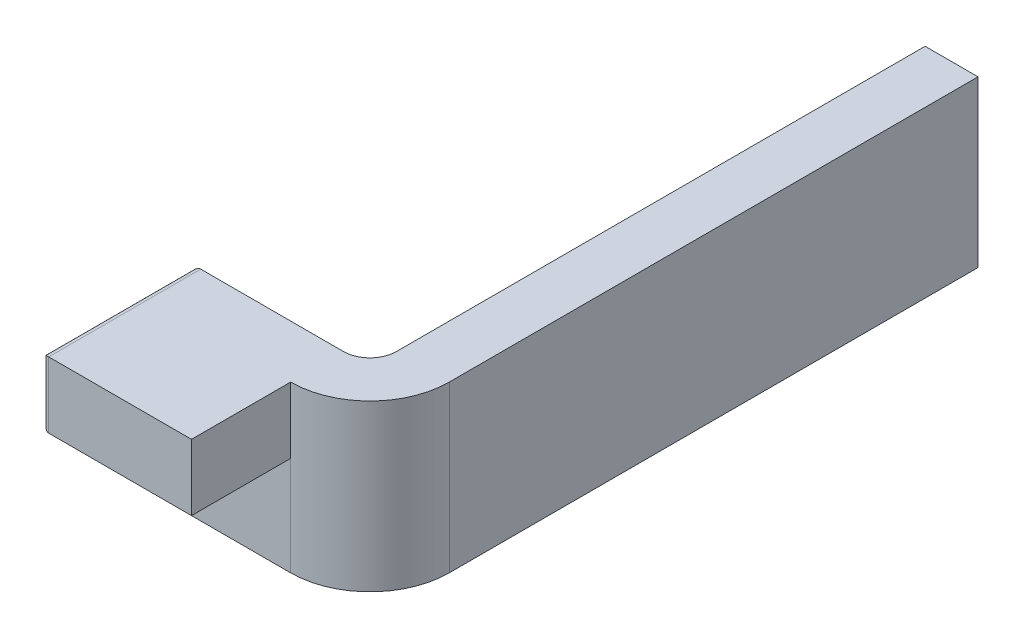
ISO-10303-21;
HEADER;
FILE_DESCRIPTION(('STEP AP214'),'2;1');
FILE_NAME('part.step','',(''),(''),'','','');
FILE_SCHEMA(('AUTOMOTIVE_DESIGN { 1 0 10303 214 1 1 1 1 }'));
ENDSEC;
DATA;
#1=APPLICATION_CONTEXT('core data for automotive mechanical design processes');
#2=APPLICATION_PROTOCOL_DEFINITION('international standard','automotive_design',2000,#1);
#3=PRODUCT_CONTEXT('',#1,'mechanical');
#4=PRODUCT('Part','Part','',(#3));
#5=PRODUCT_RELATED_PRODUCT_CATEGORY('part','',(#4));
#6=PRODUCT_DEFINITION_FORMATION('','',#4);
#7=PRODUCT_DEFINITION_CONTEXT('part definition',#1,'design');
#8=PRODUCT_DEFINITION('design','',#6,#7);
#9=PRODUCT_DEFINITION_SHAPE('','',#8);
#10=(LENGTH_UNIT() NAMED_UNIT(*) SI_UNIT(.MILLI.,.METRE.));
#11=(NAMED_UNIT(*) PLANE_ANGLE_UNIT() SI_UNIT($,.RADIAN.));
#12=(NAMED_UNIT(*) SI_UNIT($,.STERADIAN.) SOLID_ANGLE_UNIT());
#13=UNCERTAINTY_MEASURE_WITH_UNIT(LENGTH_MEASURE(1.E-05),#10,'distance_accuracy_value','');
#14=(GEOMETRIC_REPRESENTATION_CONTEXT(3) GLOBAL_UNCERTAINTY_ASSIGNED_CONTEXT((#13)) GLOBAL_UNIT_ASSIGNED_CONTEXT((#10,
#11,#12)) REPRESENTATION_CONTEXT('',''));
#15=CARTESIAN_POINT('',(0.,0.,0.));
#16=DIRECTION('',(0.,0.,1.));
#17=DIRECTION('',(1.,0.,0.));
#18=AXIS2_PLACEMENT_3D('',#15,#16,#17);
#19=CARTESIAN_POINT('',(0.,25.,8.));
#20=DIRECTION('',(0.,0.,-1.));
#21=DIRECTION('',(-1.,0.,0.));
#22=AXIS2_PLACEMENT_3D('',#19,#20,#21);
#23=PLANE('',#22);
#24=DIRECTION('',(1.,0.,0.));
#25=VECTOR('',#24,1.);
#26=CARTESIAN_POINT('',(0.,15.,8.));
#27=LINE('',#26,#25);
#28=CARTESIAN_POINT('',(1.,15.,8.));
#29=VERTEX_POINT('',#28);
#30=CARTESIAN_POINT('',(22.6,15.,8.));
#31=VERTEX_POINT('',#30);
#32=EDGE_CURVE('E152',#29,#31,#27,.T.);
#33=ORIENTED_EDGE('',*,*,#32,.F.);
#34=DIRECTION('',(0.,-1.,0.));
#35=VECTOR('',#34,1.);
#36=CARTESIAN_POINT('',(1.,25.,8.));
#37=LINE('',#36,#35);
#38=CARTESIAN_POINT('',(1.,0.,8.));
#39=VERTEX_POINT('',#38);
#40=EDGE_CURVE('E66',#29,#39,#37,.T.);
#41=ORIENTED_EDGE('',*,*,#40,.T.);
#42=DIRECTION('',(1.,0.,0.));
#43=VECTOR('',#42,1.);
#44=CARTESIAN_POINT('',(0.,0.,8.));
#45=LINE('',#44,#43);
#46=CARTESIAN_POINT('',(22.6,0.,8.));
#47=VERTEX_POINT('',#46);
#48=EDGE_CURVE('E194',#39,#47,#45,.T.);
#49=ORIENTED_EDGE('',*,*,#48,.T.);
#50=DIRECTION('',(0.,-1.,0.));
#51=VECTOR('',#50,1.);
#52=CARTESIAN_POINT('',(22.6,25.,8.));
#53=LINE('',#52,#51);
#54=EDGE_CURVE('E214',#31,#47,#53,.T.);
#55=ORIENTED_EDGE('',*,*,#54,.F.);
#56=EDGE_LOOP('',(#33,#41,#49,#55));
#57=FACE_BOUND('',#56,.T.);
#58=ADVANCED_FACE('F41',(#57),#23,.F.);
#59=CARTESIAN_POINT('',(22.6,25.,-4.));
#60=DIRECTION('',(0.,-1.,0.));
#61=DIRECTION('',(0.,0.,-1.));
#62=AXIS2_PLACEMENT_3D('',#59,#60,#61);
#63=CYLINDRICAL_SURFACE('',#62,4.);
#64=CARTESIAN_POINT('',(22.6,0.,-4.));
#65=DIRECTION('',(0.,-1.,0.));
#66=DIRECTION('',(0.,0.,1.));
#67=AXIS2_PLACEMENT_3D('',#64,#65,#66);
#68=CIRCLE('',#67,4.);
#69=CARTESIAN_POINT('',(26.6,0.,-4.));
#70=VERTEX_POINT('',#69);
#71=CARTESIAN_POINT('',(22.6,0.,0.));
#72=VERTEX_POINT('',#71);
#73=EDGE_CURVE('E160',#70,#72,#68,.T.);
#74=ORIENTED_EDGE('',*,*,#73,.T.);
#75=DIRECTION('',(0.,-1.,0.));
#76=VECTOR('',#75,1.);
#77=CARTESIAN_POINT('',(22.6,25.,0.));
#78=LINE('',#77,#76);
#79=CARTESIAN_POINT('',(22.6,25.,0.));
#80=VERTEX_POINT('',#79);
#81=EDGE_CURVE('E218',#80,#72,#78,.T.);
#82=ORIENTED_EDGE('',*,*,#81,.F.);
#83=CARTESIAN_POINT('',(22.6,25.,-4.));
#84=DIRECTION('',(0.,-1.,0.));
#85=DIRECTION('',(0.,0.,1.));
#86=AXIS2_PLACEMENT_3D('',#83,#84,#85);
#87=CIRCLE('',#86,4.);
#88=CARTESIAN_POINT('',(26.6,25.,-4.));
#89=VERTEX_POINT('',#88);
#90=EDGE_CURVE('E171',#89,#80,#87,.T.);
#91=ORIENTED_EDGE('',*,*,#90,.F.);
#92=DIRECTION('',(0.,-1.,0.));
#93=VECTOR('',#92,1.);
#94=CARTESIAN_POINT('',(26.6,25.,-4.));
#95=LINE('',#94,#93);
#96=EDGE_CURVE('E186',#89,#70,#95,.T.);
#97=ORIENTED_EDGE('',*,*,#96,.T.);
#98=EDGE_LOOP('',(#74,#82,#91,#97));
#99=FACE_BOUND('',#98,.T.);
#100=ADVANCED_FACE('F289',(#99),#63,.F.);
#101=CARTESIAN_POINT('',(0.,25.,0.));
#102=DIRECTION('',(0.,0.,1.));
#103=DIRECTION('',(1.,0.,0.));
#104=AXIS2_PLACEMENT_3D('',#101,#102,#103);
#105=PLANE('',#104);
#106=DIRECTION('',(-1.,0.,0.));
#107=VECTOR('',#106,1.);
#108=CARTESIAN_POINT('',(0.,0.,0.));
#109=LINE('',#108,#107);
#110=CARTESIAN_POINT('',(1.,0.,0.));
#111=VERTEX_POINT('',#110);
#112=EDGE_CURVE('E189',#72,#111,#109,.T.);
#113=ORIENTED_EDGE('',*,*,#112,.T.);
#114=DIRECTION('',(0.,-1.,0.));
#115=VECTOR('',#114,1.);
#116=CARTESIAN_POINT('',(1.,25.,0.));
#117=LINE('',#116,#115);
#118=CARTESIAN_POINT('',(1.,25.,0.));
#119=VERTEX_POINT('',#118);
#120=EDGE_CURVE('E11',#111,#119,#117,.F.);
#121=ORIENTED_EDGE('',*,*,#120,.T.);
#122=DIRECTION('',(-1.,0.,0.));
#123=VECTOR('',#122,1.);
#124=CARTESIAN_POINT('',(0.,25.,0.));
#125=LINE('',#124,#123);
#126=EDGE_CURVE('E174',#80,#119,#125,.T.);
#127=ORIENTED_EDGE('',*,*,#126,.F.);
#128=ORIENTED_EDGE('',*,*,#81,.T.);
#129=EDGE_LOOP('',(#113,#121,#127,#128));
#130=FACE_BOUND('',#129,.T.);
#131=ADVANCED_FACE('F284',(#130),#105,.F.);
#132=CARTESIAN_POINT('',(0.,25.,0.));
#133=DIRECTION('',(1.,0.,0.));
#134=DIRECTION('',(0.,0.,-1.));
#135=AXIS2_PLACEMENT_3D('',#132,#133,#134);
#136=PLANE('',#135);
#137=DIRECTION('',(0.,0.,1.));
#138=VECTOR('',#137,1.);
#139=CARTESIAN_POINT('',(0.,0.,0.));
#140=LINE('',#139,#138);
#141=CARTESIAN_POINT('',(0.,0.,1.));
#142=VERTEX_POINT('',#141);
#143=CARTESIAN_POINT('',(0.,0.,7.));
#144=VERTEX_POINT('',#143);
#145=EDGE_CURVE('E191',#142,#144,#140,.T.);
#146=ORIENTED_EDGE('',*,*,#145,.T.);
#147=DIRECTION('',(0.,-1.,0.));
#148=VECTOR('',#147,1.);
#149=CARTESIAN_POINT('',(0.,25.,7.));
#150=LINE('',#149,#148);
#151=CARTESIAN_POINT('',(0.,16.,7.));
#152=VERTEX_POINT('',#151);
#153=EDGE_CURVE('E230',#144,#152,#150,.F.);
#154=ORIENTED_EDGE('',*,*,#153,.T.);
#155=DIRECTION('',(0.,0.,-1.));
#156=VECTOR('',#155,1.);
#157=CARTESIAN_POINT('',(0.,16.,0.));
#158=LINE('',#157,#156);
#159=CARTESIAN_POINT('',(0.,16.,22.));
#160=VERTEX_POINT('',#159);
#161=EDGE_CURVE('E228',#152,#160,#158,.F.);
#162=ORIENTED_EDGE('',*,*,#161,.T.);
#163=DIRECTION('',(0.,-1.,0.));
#164=VECTOR('',#163,1.);
#165=CARTESIAN_POINT('',(0.,25.,22.));
#166=LINE('',#165,#164);
#167=CARTESIAN_POINT('',(0.,24.,22.));
#168=VERTEX_POINT('',#167);
#169=EDGE_CURVE('E226',#160,#168,#166,.F.);
#170=ORIENTED_EDGE('',*,*,#169,.T.);
#171=DIRECTION('',(0.,0.,1.));
#172=VECTOR('',#171,1.);
#173=CARTESIAN_POINT('',(0.,24.,0.));
#174=LINE('',#173,#172);
#175=CARTESIAN_POINT('',(0.,24.,1.));
#176=VERTEX_POINT('',#175);
#177=EDGE_CURVE('E224',#168,#176,#174,.F.);
#178=ORIENTED_EDGE('',*,*,#177,.T.);
#179=DIRECTION('',(0.,-1.,0.));
#180=VECTOR('',#179,1.);
#181=CARTESIAN_POINT('',(0.,25.,1.));
#182=LINE('',#181,#180);
#183=EDGE_CURVE('E222',#176,#142,#182,.T.);
#184=ORIENTED_EDGE('',*,*,#183,.T.);
#185=EDGE_LOOP('',(#146,#154,#162,#170,#178,#184));
#186=FACE_BOUND('',#185,.T.);
#187=ADVANCED_FACE('F260',(#186),#136,.F.);
#188=CARTESIAN_POINT('',(22.6,25.,-4.));
#189=DIRECTION('',(0.,-1.,0.));
#190=DIRECTION('',(0.,0.,-1.));
#191=AXIS2_PLACEMENT_3D('',#188,#189,#190);
#192=CYLINDRICAL_SURFACE('',#191,12.);
#193=CARTESIAN_POINT('',(22.6,0.,-4.));
#194=DIRECTION('',(0.,1.,0.));
#195=DIRECTION('',(0.,0.,1.));
#196=AXIS2_PLACEMENT_3D('',#193,#194,#195);
#197=CIRCLE('',#196,12.);
#198=CARTESIAN_POINT('',(34.6,0.,-4.));
#199=VERTEX_POINT('',#198);
#200=EDGE_CURVE('E196',#47,#199,#197,.T.);
#201=ORIENTED_EDGE('',*,*,#200,.T.);
#202=DIRECTION('',(0.,-1.,0.));
#203=VECTOR('',#202,1.);
#204=CARTESIAN_POINT('',(34.6,25.,-4.));
#205=LINE('',#204,#203);
#206=CARTESIAN_POINT('',(34.6,25.,-4.));
#207=VERTEX_POINT('',#206);
#208=EDGE_CURVE('E211',#207,#199,#205,.T.);
#209=ORIENTED_EDGE('',*,*,#208,.F.);
#210=CARTESIAN_POINT('',(22.6,25.,-4.));
#211=DIRECTION('',(0.,1.,0.));
#212=DIRECTION('',(0.,0.,1.));
#213=AXIS2_PLACEMENT_3D('',#210,#211,#212);
#214=CIRCLE('',#213,12.);
#215=CARTESIAN_POINT('',(22.6,25.,8.));
#216=VERTEX_POINT('',#215);
#217=EDGE_CURVE('E178',#216,#207,#214,.T.);
#218=ORIENTED_EDGE('',*,*,#217,.F.);
#219=EDGE_CURVE('E215',#216,#31,#53,.T.);
#220=ORIENTED_EDGE('',*,*,#219,.T.);
#221=ORIENTED_EDGE('',*,*,#54,.T.);
#222=EDGE_LOOP('',(#201,#209,#218,#220,#221));
#223=FACE_BOUND('',#222,.T.);
#224=ADVANCED_FACE('F275',(#223),#192,.T.);
#225=CARTESIAN_POINT('',(34.6,25.,-4.));
#226=DIRECTION('',(-1.,0.,0.));
#227=DIRECTION('',(0.,0.,1.));
#228=AXIS2_PLACEMENT_3D('',#225,#226,#227);
#229=PLANE('',#228);
#230=DIRECTION('',(0.,0.,-1.));
#231=VECTOR('',#230,1.);
#232=CARTESIAN_POINT('',(34.6,0.,-4.));
#233=LINE('',#232,#231);
#234=CARTESIAN_POINT('',(34.6,0.,-84.));
#235=VERTEX_POINT('',#234);
#236=EDGE_CURVE('E198',#199,#235,#233,.T.);
#237=ORIENTED_EDGE('',*,*,#236,.T.);
#238=DIRECTION('',(0.,-1.,0.));
#239=VECTOR('',#238,1.);
#240=CARTESIAN_POINT('',(34.6,25.,-84.));
#241=LINE('',#240,#239);
#242=CARTESIAN_POINT('',(34.6,25.,-84.));
#243=VERTEX_POINT('',#242);
#244=EDGE_CURVE('E208',#243,#235,#241,.T.);
#245=ORIENTED_EDGE('',*,*,#244,.F.);
#246=DIRECTION('',(0.,0.,-1.));
#247=VECTOR('',#246,1.);
#248=CARTESIAN_POINT('',(34.6,25.,-4.));
#249=LINE('',#248,#247);
#250=EDGE_CURVE('E180',#207,#243,#249,.T.);
#251=ORIENTED_EDGE('',*,*,#250,.F.);
#252=ORIENTED_EDGE('',*,*,#208,.T.);
#253=EDGE_LOOP('',(#237,#245,#251,#252));
#254=FACE_BOUND('',#253,.T.);
#255=ADVANCED_FACE('F300',(#254),#229,.F.);
#256=CARTESIAN_POINT('',(26.6,25.,-84.));
#257=DIRECTION('',(0.,0.,1.));
#258=DIRECTION('',(1.,0.,0.));
#259=AXIS2_PLACEMENT_3D('',#256,#257,#258);
#260=PLANE('',#259);
#261=DIRECTION('',(-1.,0.,0.));
#262=VECTOR('',#261,1.);
#263=CARTESIAN_POINT('',(26.6,0.,-84.));
#264=LINE('',#263,#262);
#265=CARTESIAN_POINT('',(26.6,0.,-84.));
#266=VERTEX_POINT('',#265);
#267=EDGE_CURVE('E200',#235,#266,#264,.T.);
#268=ORIENTED_EDGE('',*,*,#267,.T.);
#269=DIRECTION('',(0.,-1.,0.));
#270=VECTOR('',#269,1.);
#271=CARTESIAN_POINT('',(26.6,25.,-84.));
#272=LINE('',#271,#270);
#273=CARTESIAN_POINT('',(26.6,25.,-84.));
#274=VERTEX_POINT('',#273);
#275=EDGE_CURVE('E205',#274,#266,#272,.T.);
#276=ORIENTED_EDGE('',*,*,#275,.F.);
#277=DIRECTION('',(-1.,0.,0.));
#278=VECTOR('',#277,1.);
#279=CARTESIAN_POINT('',(26.6,25.,-84.));
#280=LINE('',#279,#278);
#281=EDGE_CURVE('E182',#243,#274,#280,.T.);
#282=ORIENTED_EDGE('',*,*,#281,.F.);
#283=ORIENTED_EDGE('',*,*,#244,.T.);
#284=EDGE_LOOP('',(#268,#276,#282,#283));
#285=FACE_BOUND('',#284,.T.);
#286=ADVANCED_FACE('F297',(#285),#260,.F.);
#287=CARTESIAN_POINT('',(26.6,25.,-4.));
#288=DIRECTION('',(1.,0.,0.));
#289=DIRECTION('',(0.,0.,-1.));
#290=AXIS2_PLACEMENT_3D('',#287,#288,#289);
#291=PLANE('',#290);
#292=DIRECTION('',(0.,0.,1.));
#293=VECTOR('',#292,1.);
#294=CARTESIAN_POINT('',(26.6,0.,-4.));
#295=LINE('',#294,#293);
#296=EDGE_CURVE('E175',#266,#70,#295,.T.);
#297=ORIENTED_EDGE('',*,*,#296,.T.);
#298=ORIENTED_EDGE('',*,*,#96,.F.);
#299=DIRECTION('',(0.,0.,1.));
#300=VECTOR('',#299,1.);
#301=CARTESIAN_POINT('',(26.6,25.,-4.));
#302=LINE('',#301,#300);
#303=EDGE_CURVE('E184',#274,#89,#302,.T.);
#304=ORIENTED_EDGE('',*,*,#303,.F.);
#305=ORIENTED_EDGE('',*,*,#275,.T.);
#306=EDGE_LOOP('',(#297,#298,#304,#305));
#307=FACE_BOUND('',#306,.T.);
#308=ADVANCED_FACE('F293',(#307),#291,.F.);
#309=CARTESIAN_POINT('',(22.6,25.,-4.));
#310=DIRECTION('',(0.,1.,0.));
#311=DIRECTION('',(0.,0.,1.));
#312=AXIS2_PLACEMENT_3D('',#309,#310,#311);
#313=PLANE('',#312);
#314=ORIENTED_EDGE('',*,*,#126,.T.);
#315=DIRECTION('',(0.,0.,1.));
#316=VECTOR('',#315,1.);
#317=CARTESIAN_POINT('',(1.,25.,23.));
#318=LINE('',#317,#316);
#319=CARTESIAN_POINT('',(1.,25.,23.));
#320=VERTEX_POINT('',#319);
#321=EDGE_CURVE('E232',#119,#320,#318,.T.);
#322=ORIENTED_EDGE('',*,*,#321,.T.);
#323=DIRECTION('',(-1.,0.,0.));
#324=VECTOR('',#323,1.);
#325=CARTESIAN_POINT('',(0.,25.,23.));
#326=LINE('',#325,#324);
#327=CARTESIAN_POINT('',(22.6,25.,23.));
#328=VERTEX_POINT('',#327);
#329=EDGE_CURVE('E165',#328,#320,#326,.T.);
#330=ORIENTED_EDGE('',*,*,#329,.F.);
#331=DIRECTION('',(0.,0.,-1.));
#332=VECTOR('',#331,1.);
#333=CARTESIAN_POINT('',(22.6,25.,23.));
#334=LINE('',#333,#332);
#335=EDGE_CURVE('E161',#328,#216,#334,.T.);
#336=ORIENTED_EDGE('',*,*,#335,.T.);
#337=ORIENTED_EDGE('',*,*,#217,.T.);
#338=ORIENTED_EDGE('',*,*,#250,.T.);
#339=ORIENTED_EDGE('',*,*,#281,.T.);
#340=ORIENTED_EDGE('',*,*,#303,.T.);
#341=ORIENTED_EDGE('',*,*,#90,.T.);
#342=EDGE_LOOP('',(#314,#322,#330,#336,#337,#338,#339,#340,#341));
#343=FACE_BOUND('',#342,.T.);
#344=ADVANCED_FACE('F279',(#343),#313,.T.);
#345=CARTESIAN_POINT('',(22.6,0.,-4.));
#346=DIRECTION('',(0.,1.,0.));
#347=DIRECTION('',(0.,0.,1.));
#348=AXIS2_PLACEMENT_3D('',#345,#346,#347);
#349=PLANE('',#348);
#350=ORIENTED_EDGE('',*,*,#48,.F.);
#351=CARTESIAN_POINT('',(1.,0.,7.));
#352=DIRECTION('',(0.,1.,0.));
#353=DIRECTION('',(0.,0.,1.));
#354=AXIS2_PLACEMENT_3D('',#351,#352,#353);
#355=CIRCLE('',#354,1.);
#356=EDGE_CURVE('E50',#39,#144,#355,.F.);
#357=ORIENTED_EDGE('',*,*,#356,.T.);
#358=ORIENTED_EDGE('',*,*,#145,.F.);
#359=CARTESIAN_POINT('',(1.,0.,1.));
#360=DIRECTION('',(0.,1.,0.));
#361=DIRECTION('',(0.,0.,1.));
#362=AXIS2_PLACEMENT_3D('',#359,#360,#361);
#363=CIRCLE('',#362,1.);
#364=EDGE_CURVE('E58',#142,#111,#363,.F.);
#365=ORIENTED_EDGE('',*,*,#364,.T.);
#366=ORIENTED_EDGE('',*,*,#112,.F.);
#367=ORIENTED_EDGE('',*,*,#73,.F.);
#368=ORIENTED_EDGE('',*,*,#296,.F.);
#369=ORIENTED_EDGE('',*,*,#267,.F.);
#370=ORIENTED_EDGE('',*,*,#236,.F.);
#371=ORIENTED_EDGE('',*,*,#200,.F.);
#372=EDGE_LOOP('',(#350,#357,#358,#365,#366,#367,#368,#369,#370,#371));
#373=FACE_BOUND('',#372,.T.);
#374=ADVANCED_FACE('F262',(#373),#349,.F.);
#375=CARTESIAN_POINT('',(0.,15.,23.));
#376=DIRECTION('',(0.,1.,0.));
#377=DIRECTION('',(0.,0.,1.));
#378=AXIS2_PLACEMENT_3D('',#375,#376,#377);
#379=PLANE('',#378);
#380=DIRECTION('',(1.,0.,0.));
#381=VECTOR('',#380,1.);
#382=CARTESIAN_POINT('',(0.,15.,23.));
#383=LINE('',#382,#381);
#384=CARTESIAN_POINT('',(1.,15.,23.));
#385=VERTEX_POINT('',#384);
#386=CARTESIAN_POINT('',(22.6,15.,23.));
#387=VERTEX_POINT('',#386);
#388=EDGE_CURVE('E142',#385,#387,#383,.T.);
#389=ORIENTED_EDGE('',*,*,#388,.F.);
#390=DIRECTION('',(0.,0.,-1.));
#391=VECTOR('',#390,1.);
#392=CARTESIAN_POINT('',(1.,15.,23.));
#393=LINE('',#392,#391);
#394=EDGE_CURVE('E234',#385,#29,#393,.T.);
#395=ORIENTED_EDGE('',*,*,#394,.T.);
#396=ORIENTED_EDGE('',*,*,#32,.T.);
#397=DIRECTION('',(0.,0.,-1.));
#398=VECTOR('',#397,1.);
#399=CARTESIAN_POINT('',(22.6,15.,23.));
#400=LINE('',#399,#398);
#401=EDGE_CURVE('E155',#387,#31,#400,.T.);
#402=ORIENTED_EDGE('',*,*,#401,.F.);
#403=EDGE_LOOP('',(#389,#395,#396,#402));
#404=FACE_BOUND('',#403,.T.);
#405=ADVANCED_FACE('F156',(#404),#379,.F.);
#406=CARTESIAN_POINT('',(22.6,25.,23.));
#407=DIRECTION('',(-1.,0.,0.));
#408=DIRECTION('',(0.,0.,1.));
#409=AXIS2_PLACEMENT_3D('',#406,#407,#408);
#410=PLANE('',#409);
#411=ORIENTED_EDGE('',*,*,#219,.F.);
#412=ORIENTED_EDGE('',*,*,#335,.F.);
#413=DIRECTION('',(0.,1.,0.));
#414=VECTOR('',#413,1.);
#415=CARTESIAN_POINT('',(22.6,25.,23.));
#416=LINE('',#415,#414);
#417=EDGE_CURVE('E147',#387,#328,#416,.T.);
#418=ORIENTED_EDGE('',*,*,#417,.F.);
#419=ORIENTED_EDGE('',*,*,#401,.T.);
#420=EDGE_LOOP('',(#411,#412,#418,#419));
#421=FACE_BOUND('',#420,.T.);
#422=ADVANCED_FACE('F163',(#421),#410,.F.);
#423=CARTESIAN_POINT('',(0.,0.,23.));
#424=DIRECTION('',(0.,0.,1.));
#425=DIRECTION('',(1.,0.,0.));
#426=AXIS2_PLACEMENT_3D('',#423,#424,#425);
#427=PLANE('',#426);
#428=ORIENTED_EDGE('',*,*,#329,.T.);
#429=DIRECTION('',(0.,-1.,0.));
#430=VECTOR('',#429,1.);
#431=CARTESIAN_POINT('',(1.,15.,23.));
#432=LINE('',#431,#430);
#433=EDGE_CURVE('E150',#320,#385,#432,.T.);
#434=ORIENTED_EDGE('',*,*,#433,.T.);
#435=ORIENTED_EDGE('',*,*,#388,.T.);
#436=ORIENTED_EDGE('',*,*,#417,.T.);
#437=EDGE_LOOP('',(#428,#434,#435,#436));
#438=FACE_BOUND('',#437,.T.);
#439=ADVANCED_FACE('F145',(#438),#427,.T.);
#440=CARTESIAN_POINT('',(1.,25.,1.));
#441=DIRECTION('',(0.,-1.,0.));
#442=DIRECTION('',(0.,0.,-1.));
#443=AXIS2_PLACEMENT_3D('',#440,#441,#442);
#444=CYLINDRICAL_SURFACE('',#443,1.);
#445=ORIENTED_EDGE('',*,*,#364,.F.);
#446=ORIENTED_EDGE('',*,*,#183,.F.);
#447=CARTESIAN_POINT('',(1.,24.,1.));
#448=DIRECTION('',(0.,-0.707106781186547,-0.707106781186547));
#449=DIRECTION('',(0.,-0.707106781186547,0.707106781186547));
#450=AXIS2_PLACEMENT_3D('',#447,#448,#449);
#451=ELLIPSE('',#450,1.41421356237309,1.);
#452=EDGE_CURVE('E45',#119,#176,#451,.F.);
#453=ORIENTED_EDGE('',*,*,#452,.F.);
#454=ORIENTED_EDGE('',*,*,#120,.F.);
#455=EDGE_LOOP('',(#445,#446,#453,#454));
#456=FACE_BOUND('',#455,.T.);
#457=ADVANCED_FACE('F43',(#456),#444,.T.);
#458=CARTESIAN_POINT('',(1.,25.,7.));
#459=DIRECTION('',(0.,-1.,0.));
#460=DIRECTION('',(0.,0.,-1.));
#461=AXIS2_PLACEMENT_3D('',#458,#459,#460);
#462=CYLINDRICAL_SURFACE('',#461,1.);
#463=ORIENTED_EDGE('',*,*,#356,.F.);
#464=ORIENTED_EDGE('',*,*,#40,.F.);
#465=CARTESIAN_POINT('',(1.,16.,7.));
#466=DIRECTION('',(0.,-0.707106781186547,-0.707106781186547));
#467=DIRECTION('',(0.,0.707106781186547,-0.707106781186547));
#468=AXIS2_PLACEMENT_3D('',#465,#466,#467);
#469=ELLIPSE('',#468,1.41421356237309,1.);
#470=EDGE_CURVE('E243',#152,#29,#469,.F.);
#471=ORIENTED_EDGE('',*,*,#470,.F.);
#472=ORIENTED_EDGE('',*,*,#153,.F.);
#473=EDGE_LOOP('',(#463,#464,#471,#472));
#474=FACE_BOUND('',#473,.T.);
#475=ADVANCED_FACE('F266',(#474),#462,.T.);
#476=CARTESIAN_POINT('',(1.,24.,-4.));
#477=DIRECTION('',(0.,0.,-1.));
#478=DIRECTION('',(-1.,0.,0.));
#479=AXIS2_PLACEMENT_3D('',#476,#477,#478);
#480=CYLINDRICAL_SURFACE('',#479,1.);
#481=ORIENTED_EDGE('',*,*,#452,.T.);
#482=ORIENTED_EDGE('',*,*,#177,.F.);
#483=CARTESIAN_POINT('',(1.,24.,22.));
#484=DIRECTION('',(0.,0.707106781186547,-0.707106781186547));
#485=DIRECTION('',(0.,-0.707106781186547,-0.707106781186547));
#486=AXIS2_PLACEMENT_3D('',#483,#484,#485);
#487=ELLIPSE('',#486,1.41421356237309,1.);
#488=EDGE_CURVE('E241',#320,#168,#487,.F.);
#489=ORIENTED_EDGE('',*,*,#488,.F.);
#490=ORIENTED_EDGE('',*,*,#321,.F.);
#491=EDGE_LOOP('',(#481,#482,#489,#490));
#492=FACE_BOUND('',#491,.T.);
#493=ADVANCED_FACE('F254',(#492),#480,.T.);
#494=CARTESIAN_POINT('',(1.,16.,23.));
#495=DIRECTION('',(0.,0.,-1.));
#496=DIRECTION('',(-1.,0.,0.));
#497=AXIS2_PLACEMENT_3D('',#494,#495,#496);
#498=CYLINDRICAL_SURFACE('',#497,1.);
#499=ORIENTED_EDGE('',*,*,#470,.T.);
#500=ORIENTED_EDGE('',*,*,#394,.F.);
#501=CARTESIAN_POINT('',(1.,16.,22.));
#502=DIRECTION('',(0.,-0.707106781186547,-0.707106781186547));
#503=DIRECTION('',(0.,0.707106781186547,-0.707106781186547));
#504=AXIS2_PLACEMENT_3D('',#501,#502,#503);
#505=ELLIPSE('',#504,1.41421356237309,1.);
#506=EDGE_CURVE('E239',#160,#385,#505,.F.);
#507=ORIENTED_EDGE('',*,*,#506,.F.);
#508=ORIENTED_EDGE('',*,*,#161,.F.);
#509=EDGE_LOOP('',(#499,#500,#507,#508));
#510=FACE_BOUND('',#509,.T.);
#511=ADVANCED_FACE('F271',(#510),#498,.T.);
#512=CARTESIAN_POINT('',(1.,0.,22.));
#513=DIRECTION('',(0.,1.,0.));
#514=DIRECTION('',(0.,0.,1.));
#515=AXIS2_PLACEMENT_3D('',#512,#513,#514);
#516=CYLINDRICAL_SURFACE('',#515,1.);
#517=ORIENTED_EDGE('',*,*,#488,.T.);
#518=ORIENTED_EDGE('',*,*,#169,.F.);
#519=ORIENTED_EDGE('',*,*,#506,.T.);
#520=ORIENTED_EDGE('',*,*,#433,.F.);
#521=EDGE_LOOP('',(#517,#518,#519,#520));
#522=FACE_BOUND('',#521,.T.);
#523=ADVANCED_FACE('F270',(#522),#516,.T.);
#524=CLOSED_SHELL('',(#58,#100,#131,#187,#224,#255,#286,#308,#344,#374,#405,#422,#439,#457,#475,
#493,#511,#523));
#525=MANIFOLD_SOLID_BREP('B2',#524);
#526=ADVANCED_BREP_SHAPE_REPRESENTATION('',(#18,#525),#14);
#527=SHAPE_DEFINITION_REPRESENTATION(#9,#526);
ENDSEC;
END-ISO-10303-21;
